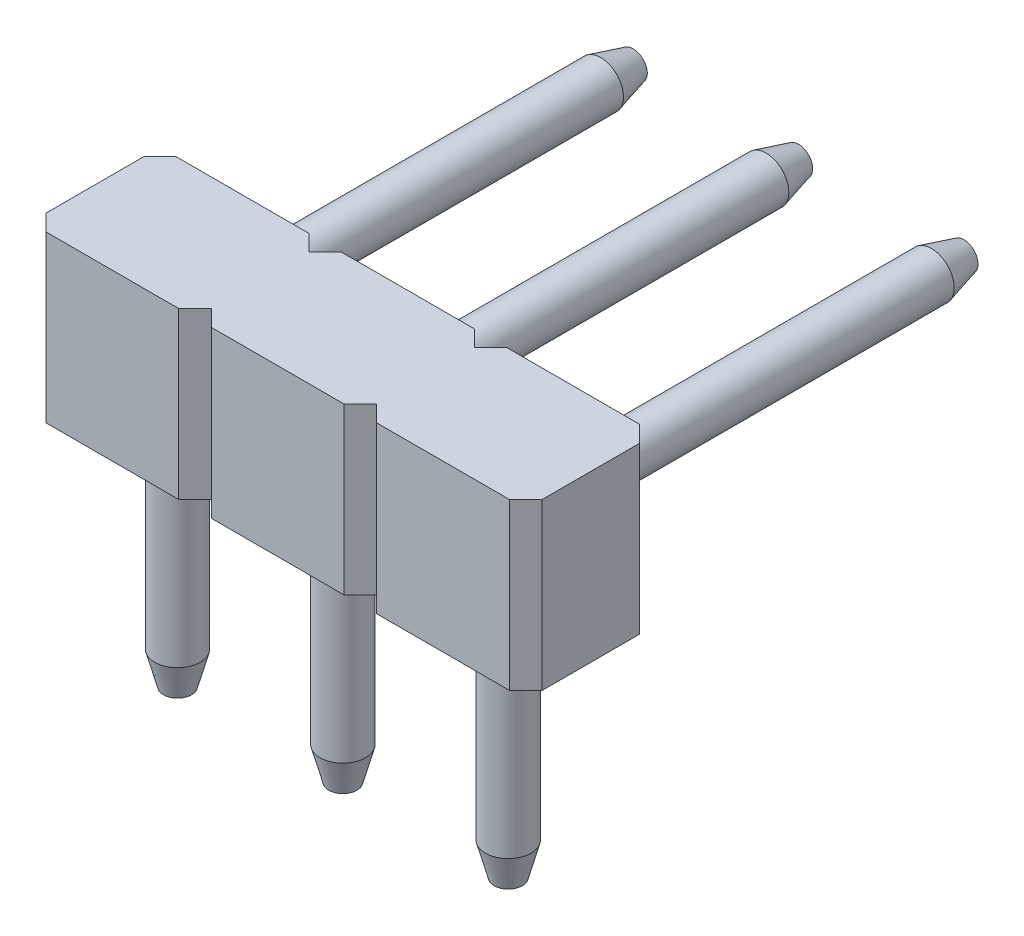
ISO-10303-21;
HEADER;
FILE_DESCRIPTION(('STEP AP214'),'2;1');
FILE_NAME('part.step','',(''),(''),'','','');
FILE_SCHEMA(('AUTOMOTIVE_DESIGN { 1 0 10303 214 1 1 1 1 }'));
ENDSEC;
DATA;
#1=APPLICATION_CONTEXT('core data for automotive mechanical design processes');
#2=APPLICATION_PROTOCOL_DEFINITION('international standard','automotive_design',2000,#1);
#3=PRODUCT_CONTEXT('',#1,'mechanical');
#4=PRODUCT('Part','Part','',(#3));
#5=PRODUCT_RELATED_PRODUCT_CATEGORY('part','',(#4));
#6=PRODUCT_DEFINITION_FORMATION('','',#4);
#7=PRODUCT_DEFINITION_CONTEXT('part definition',#1,'design');
#8=PRODUCT_DEFINITION('design','',#6,#7);
#9=PRODUCT_DEFINITION_SHAPE('','',#8);
#10=(LENGTH_UNIT() NAMED_UNIT(*) SI_UNIT(.MILLI.,.METRE.));
#11=(NAMED_UNIT(*) PLANE_ANGLE_UNIT() SI_UNIT($,.RADIAN.));
#12=(NAMED_UNIT(*) SI_UNIT($,.STERADIAN.) SOLID_ANGLE_UNIT());
#13=UNCERTAINTY_MEASURE_WITH_UNIT(LENGTH_MEASURE(1.E-05),#10,'distance_accuracy_value','');
#14=(GEOMETRIC_REPRESENTATION_CONTEXT(3) GLOBAL_UNCERTAINTY_ASSIGNED_CONTEXT((#13)) GLOBAL_UNIT_ASSIGNED_CONTEXT((#10,
#11,#12)) REPRESENTATION_CONTEXT('',''));
#15=CARTESIAN_POINT('',(0.,0.,0.));
#16=DIRECTION('',(0.,0.,1.));
#17=DIRECTION('',(1.,0.,0.));
#18=AXIS2_PLACEMENT_3D('',#15,#16,#17);
#19=CARTESIAN_POINT('',(5.08,-3.5,0.));
#20=DIRECTION('',(0.,1.,0.));
#21=DIRECTION('',(0.,0.,1.));
#22=AXIS2_PLACEMENT_3D('',#19,#20,#21);
#23=CYLINDRICAL_SURFACE('',#22,0.35);
#24=CARTESIAN_POINT('',(5.08,0.499999999999993,0.));
#25=DIRECTION('',(0.,1.,0.));
#26=DIRECTION('',(0.,0.,1.));
#27=AXIS2_PLACEMENT_3D('',#24,#25,#26);
#28=CIRCLE('',#27,0.35);
#29=CARTESIAN_POINT('',(5.08,0.499999999999993,0.35));
#30=VERTEX_POINT('',#29);
#31=EDGE_CURVE('E49',#30,#30,#28,.F.);
#32=ORIENTED_EDGE('',*,*,#31,.T.);
#33=EDGE_LOOP('',(#32));
#34=FACE_BOUND('',#33,.T.);
#35=CARTESIAN_POINT('',(5.08,-3.,0.));
#36=DIRECTION('',(0.,1.,0.));
#37=DIRECTION('',(0.,0.,1.));
#38=AXIS2_PLACEMENT_3D('',#35,#36,#37);
#39=CIRCLE('',#38,0.35);
#40=CARTESIAN_POINT('',(5.08,-3.,0.35));
#41=VERTEX_POINT('',#40);
#42=EDGE_CURVE('E53',#41,#41,#39,.T.);
#43=ORIENTED_EDGE('',*,*,#42,.T.);
#44=EDGE_LOOP('',(#43));
#45=FACE_BOUND('',#44,.T.);
#46=ADVANCED_FACE('F42',(#34,#45),#23,.T.);
#47=CARTESIAN_POINT('',(5.08,-3.5,0.));
#48=DIRECTION('',(0.,1.,0.));
#49=DIRECTION('',(0.,0.,1.));
#50=AXIS2_PLACEMENT_3D('',#47,#48,#49);
#51=PLANE('',#50);
#52=CARTESIAN_POINT('',(5.08,-3.5,0.));
#53=DIRECTION('',(0.,1.,0.));
#54=DIRECTION('',(0.,0.,1.));
#55=AXIS2_PLACEMENT_3D('',#52,#53,#54);
#56=CIRCLE('',#55,0.21602540378444);
#57=CARTESIAN_POINT('',(5.08,-3.5,0.21602540378444));
#58=VERTEX_POINT('',#57);
#59=EDGE_CURVE('E11',#58,#58,#56,.F.);
#60=ORIENTED_EDGE('',*,*,#59,.T.);
#61=EDGE_LOOP('',(#60));
#62=FACE_BOUND('',#61,.T.);
#63=ADVANCED_FACE('F73',(#62),#51,.F.);
#64=CARTESIAN_POINT('',(5.08,1.,0.));
#65=DIRECTION('',(0.,1.,0.));
#66=DIRECTION('',(0.,0.,1.));
#67=AXIS2_PLACEMENT_3D('',#64,#65,#66);
#68=PLANE('',#67);
#69=CARTESIAN_POINT('',(5.08,1.,0.));
#70=DIRECTION('',(0.,1.,0.));
#71=DIRECTION('',(0.,0.,1.));
#72=AXIS2_PLACEMENT_3D('',#69,#70,#71);
#73=CIRCLE('',#72,0.216025403784438);
#74=CARTESIAN_POINT('',(5.08,1.,0.216025403784438));
#75=VERTEX_POINT('',#74);
#76=EDGE_CURVE('E57',#75,#75,#73,.T.);
#77=ORIENTED_EDGE('',*,*,#76,.T.);
#78=EDGE_LOOP('',(#77));
#79=FACE_BOUND('',#78,.T.);
#80=ADVANCED_FACE('F63',(#79),#68,.T.);
#81=CARTESIAN_POINT('',(5.08,1.,0.));
#82=DIRECTION('',(0.,-1.,0.));
#83=DIRECTION('',(0.,0.,-1.));
#84=AXIS2_PLACEMENT_3D('',#81,#82,#83);
#85=CONICAL_SURFACE('',#84,0.216025403784438,0.261799387799146);
#86=ORIENTED_EDGE('',*,*,#31,.F.);
#87=EDGE_LOOP('',(#86));
#88=FACE_BOUND('',#87,.T.);
#89=ORIENTED_EDGE('',*,*,#76,.F.);
#90=EDGE_LOOP('',(#89));
#91=FACE_BOUND('',#90,.T.);
#92=ADVANCED_FACE('F65',(#88,#91),#85,.T.);
#93=CARTESIAN_POINT('',(5.08,-3.,0.));
#94=DIRECTION('',(0.,1.,0.));
#95=DIRECTION('',(0.,0.,1.));
#96=AXIS2_PLACEMENT_3D('',#93,#94,#95);
#97=CONICAL_SURFACE('',#96,0.35,0.261799387799147);
#98=ORIENTED_EDGE('',*,*,#59,.F.);
#99=EDGE_LOOP('',(#98));
#100=FACE_BOUND('',#99,.T.);
#101=ORIENTED_EDGE('',*,*,#42,.F.);
#102=EDGE_LOOP('',(#101));
#103=FACE_BOUND('',#102,.T.);
#104=ADVANCED_FACE('F44',(#100,#103),#97,.T.);
#105=CLOSED_SHELL('',(#46,#63,#80,#92,#104));
#106=MANIFOLD_SOLID_BREP('B2',#105);
#107=CARTESIAN_POINT('',(2.54,-3.5,0.));
#108=DIRECTION('',(0.,1.,0.));
#109=DIRECTION('',(0.,0.,1.));
#110=AXIS2_PLACEMENT_3D('',#107,#108,#109);
#111=CYLINDRICAL_SURFACE('',#110,0.35);
#112=CARTESIAN_POINT('',(2.54,-3.,0.));
#113=DIRECTION('',(0.,1.,0.));
#114=DIRECTION('',(0.,0.,1.));
#115=AXIS2_PLACEMENT_3D('',#112,#113,#114);
#116=CIRCLE('',#115,0.35);
#117=CARTESIAN_POINT('',(2.54,-3.,0.35));
#118=VERTEX_POINT('',#117);
#119=EDGE_CURVE('E133',#118,#118,#116,.T.);
#120=ORIENTED_EDGE('',*,*,#119,.T.);
#121=EDGE_LOOP('',(#120));
#122=FACE_BOUND('',#121,.T.);
#123=CARTESIAN_POINT('',(2.54,0.499999999999995,0.));
#124=DIRECTION('',(0.,1.,0.));
#125=DIRECTION('',(0.,0.,1.));
#126=AXIS2_PLACEMENT_3D('',#123,#124,#125);
#127=CIRCLE('',#126,0.35);
#128=CARTESIAN_POINT('',(2.54,0.499999999999995,0.35));
#129=VERTEX_POINT('',#128);
#130=EDGE_CURVE('E137',#129,#129,#127,.F.);
#131=ORIENTED_EDGE('',*,*,#130,.T.);
#132=EDGE_LOOP('',(#131));
#133=FACE_BOUND('',#132,.T.);
#134=ADVANCED_FACE('F122',(#122,#133),#111,.T.);
#135=CARTESIAN_POINT('',(2.54,-3.5,0.));
#136=DIRECTION('',(0.,1.,0.));
#137=DIRECTION('',(0.,0.,1.));
#138=AXIS2_PLACEMENT_3D('',#135,#136,#137);
#139=PLANE('',#138);
#140=CARTESIAN_POINT('',(2.54,-3.5,0.));
#141=DIRECTION('',(0.,1.,0.));
#142=DIRECTION('',(0.,0.,1.));
#143=AXIS2_PLACEMENT_3D('',#140,#141,#142);
#144=CIRCLE('',#143,0.21602540378444);
#145=CARTESIAN_POINT('',(2.54,-3.5,0.21602540378444));
#146=VERTEX_POINT('',#145);
#147=EDGE_CURVE('E129',#146,#146,#144,.F.);
#148=ORIENTED_EDGE('',*,*,#147,.T.);
#149=EDGE_LOOP('',(#148));
#150=FACE_BOUND('',#149,.T.);
#151=ADVANCED_FACE('F153',(#150),#139,.F.);
#152=CARTESIAN_POINT('',(2.54,1.,0.));
#153=DIRECTION('',(0.,1.,0.));
#154=DIRECTION('',(0.,0.,1.));
#155=AXIS2_PLACEMENT_3D('',#152,#153,#154);
#156=PLANE('',#155);
#157=CARTESIAN_POINT('',(2.54,1.,0.));
#158=DIRECTION('',(0.,1.,0.));
#159=DIRECTION('',(0.,0.,1.));
#160=AXIS2_PLACEMENT_3D('',#157,#158,#159);
#161=CIRCLE('',#160,0.216025403784439);
#162=CARTESIAN_POINT('',(2.54,1.,0.216025403784439));
#163=VERTEX_POINT('',#162);
#164=EDGE_CURVE('E41',#163,#163,#161,.T.);
#165=ORIENTED_EDGE('',*,*,#164,.T.);
#166=EDGE_LOOP('',(#165));
#167=FACE_BOUND('',#166,.T.);
#168=ADVANCED_FACE('F150',(#167),#156,.T.);
#169=CARTESIAN_POINT('',(2.54,-3.,0.));
#170=DIRECTION('',(0.,1.,0.));
#171=DIRECTION('',(0.,0.,1.));
#172=AXIS2_PLACEMENT_3D('',#169,#170,#171);
#173=CONICAL_SURFACE('',#172,0.35,0.261799387799147);
#174=ORIENTED_EDGE('',*,*,#147,.F.);
#175=EDGE_LOOP('',(#174));
#176=FACE_BOUND('',#175,.T.);
#177=ORIENTED_EDGE('',*,*,#119,.F.);
#178=EDGE_LOOP('',(#177));
#179=FACE_BOUND('',#178,.T.);
#180=ADVANCED_FACE('F146',(#176,#179),#173,.T.);
#181=CARTESIAN_POINT('',(2.54,1.,0.));
#182=DIRECTION('',(0.,-1.,0.));
#183=DIRECTION('',(0.,0.,-1.));
#184=AXIS2_PLACEMENT_3D('',#181,#182,#183);
#185=CONICAL_SURFACE('',#184,0.216025403784439,0.261799387799146);
#186=ORIENTED_EDGE('',*,*,#130,.F.);
#187=EDGE_LOOP('',(#186));
#188=FACE_BOUND('',#187,.T.);
#189=ORIENTED_EDGE('',*,*,#164,.F.);
#190=EDGE_LOOP('',(#189));
#191=FACE_BOUND('',#190,.T.);
#192=ADVANCED_FACE('F124',(#188,#191),#185,.T.);
#193=CLOSED_SHELL('',(#134,#151,#168,#180,#192));
#194=MANIFOLD_SOLID_BREP('B6',#193);
#195=CARTESIAN_POINT('',(-1.02,2.54,-1.));
#196=DIRECTION('',(0.,0.,1.));
#197=DIRECTION('',(1.,0.,0.));
#198=AXIS2_PLACEMENT_3D('',#195,#196,#197);
#199=PLANE('',#198);
#200=DIRECTION('',(-1.,0.,0.));
#201=VECTOR('',#200,1.);
#202=CARTESIAN_POINT('',(-1.02,0.,-1.));
#203=LINE('',#202,#201);
#204=CARTESIAN_POINT('',(1.02,0.,-1.));
#205=VERTEX_POINT('',#204);
#206=CARTESIAN_POINT('',(-1.02,0.,-1.));
#207=VERTEX_POINT('',#206);
#208=EDGE_CURVE('E364',#205,#207,#203,.T.);
#209=ORIENTED_EDGE('',*,*,#208,.T.);
#210=DIRECTION('',(0.,-1.,0.));
#211=VECTOR('',#210,1.);
#212=CARTESIAN_POINT('',(-1.02,2.54,-1.));
#213=LINE('',#212,#211);
#214=CARTESIAN_POINT('',(-1.02,2.54,-1.));
#215=VERTEX_POINT('',#214);
#216=EDGE_CURVE('E451',#215,#207,#213,.T.);
#217=ORIENTED_EDGE('',*,*,#216,.F.);
#218=DIRECTION('',(-1.,0.,0.));
#219=VECTOR('',#218,1.);
#220=CARTESIAN_POINT('',(-1.02,2.54,-1.));
#221=LINE('',#220,#219);
#222=CARTESIAN_POINT('',(1.02,2.54,-1.));
#223=VERTEX_POINT('',#222);
#224=EDGE_CURVE('E402',#223,#215,#221,.T.);
#225=ORIENTED_EDGE('',*,*,#224,.F.);
#226=DIRECTION('',(0.,-1.,0.));
#227=VECTOR('',#226,1.);
#228=CARTESIAN_POINT('',(1.02,2.54,-1.));
#229=LINE('',#228,#227);
#230=EDGE_CURVE('E360',#223,#205,#229,.T.);
#231=ORIENTED_EDGE('',*,*,#230,.T.);
#232=EDGE_LOOP('',(#209,#217,#225,#231));
#233=FACE_BOUND('',#232,.T.);
#234=CARTESIAN_POINT('',(0.,1.27,-1.));
#235=DIRECTION('',(0.,0.,1.));
#236=DIRECTION('',(1.,0.,0.));
#237=AXIS2_PLACEMENT_3D('',#234,#235,#236);
#238=CIRCLE('',#237,0.35);
#239=CARTESIAN_POINT('',(0.349999999999998,1.27,-1.));
#240=VERTEX_POINT('',#239);
#241=EDGE_CURVE('E468',#240,#240,#238,.F.);
#242=ORIENTED_EDGE('',*,*,#241,.F.);
#243=EDGE_LOOP('',(#242));
#244=FACE_BOUND('',#243,.T.);
#245=ADVANCED_FACE('F193',(#233,#244),#199,.F.);
#246=CARTESIAN_POINT('',(1.52,2.54,-1.));
#247=DIRECTION('',(0.,0.,1.));
#248=DIRECTION('',(1.,0.,0.));
#249=AXIS2_PLACEMENT_3D('',#246,#247,#248);
#250=PLANE('',#249);
#251=DIRECTION('',(-1.,0.,0.));
#252=VECTOR('',#251,1.);
#253=CARTESIAN_POINT('',(1.52,0.,-1.));
#254=LINE('',#253,#252);
#255=CARTESIAN_POINT('',(3.56,0.,-1.));
#256=VERTEX_POINT('',#255);
#257=CARTESIAN_POINT('',(1.52,0.,-1.));
#258=VERTEX_POINT('',#257);
#259=EDGE_CURVE('E354',#256,#258,#254,.T.);
#260=ORIENTED_EDGE('',*,*,#259,.T.);
#261=DIRECTION('',(0.,-1.,0.));
#262=VECTOR('',#261,1.);
#263=CARTESIAN_POINT('',(1.52,2.54,-1.));
#264=LINE('',#263,#262);
#265=CARTESIAN_POINT('',(1.52,2.54,-1.));
#266=VERTEX_POINT('',#265);
#267=EDGE_CURVE('E350',#266,#258,#264,.T.);
#268=ORIENTED_EDGE('',*,*,#267,.F.);
#269=DIRECTION('',(-1.,0.,0.));
#270=VECTOR('',#269,1.);
#271=CARTESIAN_POINT('',(1.52,2.54,-1.));
#272=LINE('',#271,#270);
#273=CARTESIAN_POINT('',(3.56,2.54,-1.));
#274=VERTEX_POINT('',#273);
#275=EDGE_CURVE('E339',#274,#266,#272,.T.);
#276=ORIENTED_EDGE('',*,*,#275,.F.);
#277=DIRECTION('',(0.,-1.,0.));
#278=VECTOR('',#277,1.);
#279=CARTESIAN_POINT('',(3.56,2.54,-1.));
#280=LINE('',#279,#278);
#281=EDGE_CURVE('E355',#274,#256,#280,.T.);
#282=ORIENTED_EDGE('',*,*,#281,.T.);
#283=EDGE_LOOP('',(#260,#268,#276,#282));
#284=FACE_BOUND('',#283,.T.);
#285=CARTESIAN_POINT('',(2.54,1.27,-1.));
#286=DIRECTION('',(0.,0.,1.));
#287=DIRECTION('',(1.,0.,0.));
#288=AXIS2_PLACEMENT_3D('',#285,#286,#287);
#289=CIRCLE('',#288,0.35);
#290=CARTESIAN_POINT('',(2.89,1.27,-1.));
#291=VERTEX_POINT('',#290);
#292=EDGE_CURVE('E465',#291,#291,#289,.F.);
#293=ORIENTED_EDGE('',*,*,#292,.F.);
#294=EDGE_LOOP('',(#293));
#295=FACE_BOUND('',#294,.T.);
#296=ADVANCED_FACE('F351',(#284,#295),#250,.F.);
#297=CARTESIAN_POINT('',(4.06,2.54,-1.));
#298=DIRECTION('',(0.,0.,1.));
#299=DIRECTION('',(1.,0.,0.));
#300=AXIS2_PLACEMENT_3D('',#297,#298,#299);
#301=PLANE('',#300);
#302=DIRECTION('',(-1.,0.,0.));
#303=VECTOR('',#302,1.);
#304=CARTESIAN_POINT('',(4.06,0.,-1.));
#305=LINE('',#304,#303);
#306=CARTESIAN_POINT('',(6.1,0.,-1.));
#307=VERTEX_POINT('',#306);
#308=CARTESIAN_POINT('',(4.06,0.,-1.));
#309=VERTEX_POINT('',#308);
#310=EDGE_CURVE('E393',#307,#309,#305,.T.);
#311=ORIENTED_EDGE('',*,*,#310,.T.);
#312=DIRECTION('',(0.,-1.,0.));
#313=VECTOR('',#312,1.);
#314=CARTESIAN_POINT('',(4.06,2.54,-1.));
#315=LINE('',#314,#313);
#316=CARTESIAN_POINT('',(4.06,2.54,-1.));
#317=VERTEX_POINT('',#316);
#318=EDGE_CURVE('E409',#317,#309,#315,.T.);
#319=ORIENTED_EDGE('',*,*,#318,.F.);
#320=DIRECTION('',(-1.,0.,0.));
#321=VECTOR('',#320,1.);
#322=CARTESIAN_POINT('',(4.06,2.54,-1.));
#323=LINE('',#322,#321);
#324=CARTESIAN_POINT('',(6.1,2.54,-1.));
#325=VERTEX_POINT('',#324);
#326=EDGE_CURVE('E658',#325,#317,#323,.T.);
#327=ORIENTED_EDGE('',*,*,#326,.F.);
#328=DIRECTION('',(0.,-1.,0.));
#329=VECTOR('',#328,1.);
#330=CARTESIAN_POINT('',(6.1,2.54,-1.));
#331=LINE('',#330,#329);
#332=EDGE_CURVE('E412',#325,#307,#331,.T.);
#333=ORIENTED_EDGE('',*,*,#332,.T.);
#334=EDGE_LOOP('',(#311,#319,#327,#333));
#335=FACE_BOUND('',#334,.T.);
#336=CARTESIAN_POINT('',(5.08,1.27,-1.));
#337=DIRECTION('',(0.,0.,1.));
#338=DIRECTION('',(1.,0.,0.));
#339=AXIS2_PLACEMENT_3D('',#336,#337,#338);
#340=CIRCLE('',#339,0.35);
#341=CARTESIAN_POINT('',(5.43,1.27,-1.));
#342=VERTEX_POINT('',#341);
#343=EDGE_CURVE('E462',#342,#342,#340,.F.);
#344=ORIENTED_EDGE('',*,*,#343,.F.);
#345=EDGE_LOOP('',(#344));
#346=FACE_BOUND('',#345,.T.);
#347=ADVANCED_FACE('F502',(#335,#346),#301,.F.);
#348=CARTESIAN_POINT('',(0.,-3.5,0.));
#349=DIRECTION('',(0.,1.,0.));
#350=DIRECTION('',(0.,0.,1.));
#351=AXIS2_PLACEMENT_3D('',#348,#349,#350);
#352=CYLINDRICAL_SURFACE('',#351,0.35);
#353=CARTESIAN_POINT('',(0.,0.,0.));
#354=DIRECTION('',(0.,-1.,0.));
#355=DIRECTION('',(0.,0.,-1.));
#356=AXIS2_PLACEMENT_3D('',#353,#354,#355);
#357=CIRCLE('',#356,0.35);
#358=CARTESIAN_POINT('',(0.,0.,-0.35));
#359=VERTEX_POINT('',#358);
#360=EDGE_CURVE('E459',#359,#359,#357,.F.);
#361=ORIENTED_EDGE('',*,*,#360,.F.);
#362=EDGE_LOOP('',(#361));
#363=FACE_BOUND('',#362,.T.);
#364=CARTESIAN_POINT('',(0.,-3.,0.));
#365=DIRECTION('',(0.,1.,0.));
#366=DIRECTION('',(0.,0.,1.));
#367=AXIS2_PLACEMENT_3D('',#364,#365,#366);
#368=CIRCLE('',#367,0.35);
#369=CARTESIAN_POINT('',(0.,-3.,0.35));
#370=VERTEX_POINT('',#369);
#371=EDGE_CURVE('E453',#370,#370,#368,.T.);
#372=ORIENTED_EDGE('',*,*,#371,.T.);
#373=EDGE_LOOP('',(#372));
#374=FACE_BOUND('',#373,.T.);
#375=ADVANCED_FACE('F513',(#363,#374),#352,.T.);
#376=CARTESIAN_POINT('',(0.,-3.5,0.));
#377=DIRECTION('',(0.,1.,0.));
#378=DIRECTION('',(0.,0.,1.));
#379=AXIS2_PLACEMENT_3D('',#376,#377,#378);
#380=PLANE('',#379);
#381=CARTESIAN_POINT('',(0.,-3.5,0.));
#382=DIRECTION('',(0.,1.,0.));
#383=DIRECTION('',(0.,0.,1.));
#384=AXIS2_PLACEMENT_3D('',#381,#382,#383);
#385=CIRCLE('',#384,0.21602540378444);
#386=CARTESIAN_POINT('',(0.,-3.5,0.21602540378444));
#387=VERTEX_POINT('',#386);
#388=EDGE_CURVE('E456',#387,#387,#385,.F.);
#389=ORIENTED_EDGE('',*,*,#388,.T.);
#390=EDGE_LOOP('',(#389));
#391=FACE_BOUND('',#390,.T.);
#392=ADVANCED_FACE('F509',(#391),#380,.F.);
#393=CARTESIAN_POINT('',(0.,-3.,0.));
#394=DIRECTION('',(0.,1.,0.));
#395=DIRECTION('',(0.,0.,1.));
#396=AXIS2_PLACEMENT_3D('',#393,#394,#395);
#397=CONICAL_SURFACE('',#396,0.35,0.261799387799147);
#398=ORIENTED_EDGE('',*,*,#388,.F.);
#399=EDGE_LOOP('',(#398));
#400=FACE_BOUND('',#399,.T.);
#401=ORIENTED_EDGE('',*,*,#371,.F.);
#402=EDGE_LOOP('',(#401));
#403=FACE_BOUND('',#402,.T.);
#404=ADVANCED_FACE('F512',(#400,#403),#397,.T.);
#405=CARTESIAN_POINT('',(-1.27,2.54,-0.75));
#406=DIRECTION('',(0.707106781186548,0.,0.707106781186548));
#407=DIRECTION('',(0.707106781186548,0.,-0.707106781186548));
#408=AXIS2_PLACEMENT_3D('',#405,#406,#407);
#409=PLANE('',#408);
#410=DIRECTION('',(-0.707106781186548,0.,0.707106781186548));
#411=VECTOR('',#410,1.);
#412=CARTESIAN_POINT('',(-1.27,0.,-0.75));
#413=LINE('',#412,#411);
#414=CARTESIAN_POINT('',(-1.27,0.,-0.75));
#415=VERTEX_POINT('',#414);
#416=EDGE_CURVE('E367',#207,#415,#413,.T.);
#417=ORIENTED_EDGE('',*,*,#416,.T.);
#418=DIRECTION('',(0.,-1.,0.));
#419=VECTOR('',#418,1.);
#420=CARTESIAN_POINT('',(-1.27,2.54,-0.75));
#421=LINE('',#420,#419);
#422=CARTESIAN_POINT('',(-1.27,2.54,-0.75));
#423=VERTEX_POINT('',#422);
#424=EDGE_CURVE('E448',#423,#415,#421,.T.);
#425=ORIENTED_EDGE('',*,*,#424,.F.);
#426=DIRECTION('',(-0.707106781186548,0.,0.707106781186548));
#427=VECTOR('',#426,1.);
#428=CARTESIAN_POINT('',(-1.27,2.54,-0.75));
#429=LINE('',#428,#427);
#430=EDGE_CURVE('E290',#215,#423,#429,.T.);
#431=ORIENTED_EDGE('',*,*,#430,.F.);
#432=ORIENTED_EDGE('',*,*,#216,.T.);
#433=EDGE_LOOP('',(#417,#425,#431,#432));
#434=FACE_BOUND('',#433,.T.);
#435=ADVANCED_FACE('F507',(#434),#409,.F.);
#436=CARTESIAN_POINT('',(-1.27,2.54,-0.75));
#437=DIRECTION('',(1.,0.,0.));
#438=DIRECTION('',(0.,0.,-1.));
#439=AXIS2_PLACEMENT_3D('',#436,#437,#438);
#440=PLANE('',#439);
#441=DIRECTION('',(0.,0.,1.));
#442=VECTOR('',#441,1.);
#443=CARTESIAN_POINT('',(-1.27,0.,-0.75));
#444=LINE('',#443,#442);
#445=CARTESIAN_POINT('',(-1.27,0.,0.750018973036948));
#446=VERTEX_POINT('',#445);
#447=EDGE_CURVE('E369',#415,#446,#444,.T.);
#448=ORIENTED_EDGE('',*,*,#447,.T.);
#449=DIRECTION('',(0.,-1.,0.));
#450=VECTOR('',#449,1.);
#451=CARTESIAN_POINT('',(-1.27,2.54,0.750018973036948));
#452=LINE('',#451,#450);
#453=CARTESIAN_POINT('',(-1.27,2.54,0.750018973036948));
#454=VERTEX_POINT('',#453);
#455=EDGE_CURVE('E445',#454,#446,#452,.T.);
#456=ORIENTED_EDGE('',*,*,#455,.F.);
#457=DIRECTION('',(0.,0.,1.));
#458=VECTOR('',#457,1.);
#459=CARTESIAN_POINT('',(-1.27,2.54,-0.75));
#460=LINE('',#459,#458);
#461=EDGE_CURVE('E670',#423,#454,#460,.T.);
#462=ORIENTED_EDGE('',*,*,#461,.F.);
#463=ORIENTED_EDGE('',*,*,#424,.T.);
#464=EDGE_LOOP('',(#448,#456,#462,#463));
#465=FACE_BOUND('',#464,.T.);
#466=ADVANCED_FACE('F612',(#465),#440,.F.);
#467=CARTESIAN_POINT('',(-1.27,2.54,0.750018973036948));
#468=DIRECTION('',(0.707106781186548,0.,-0.707106781186548));
#469=DIRECTION('',(-0.707106781186548,0.,-0.707106781186548));
#470=AXIS2_PLACEMENT_3D('',#467,#468,#469);
#471=PLANE('',#470);
#472=DIRECTION('',(0.707106781186548,0.,0.707106781186548));
#473=VECTOR('',#472,1.);
#474=CARTESIAN_POINT('',(-1.27,0.,0.750018973036948));
#475=LINE('',#474,#473);
#476=CARTESIAN_POINT('',(-1.02,0.,1.00001897303695));
#477=VERTEX_POINT('',#476);
#478=EDGE_CURVE('E371',#446,#477,#475,.T.);
#479=ORIENTED_EDGE('',*,*,#478,.T.);
#480=DIRECTION('',(0.,-1.,0.));
#481=VECTOR('',#480,1.);
#482=CARTESIAN_POINT('',(-1.02,2.54,1.00001897303695));
#483=LINE('',#482,#481);
#484=CARTESIAN_POINT('',(-1.02,2.54,1.00001897303695));
#485=VERTEX_POINT('',#484);
#486=EDGE_CURVE('E442',#485,#477,#483,.T.);
#487=ORIENTED_EDGE('',*,*,#486,.F.);
#488=DIRECTION('',(0.707106781186548,0.,0.707106781186548));
#489=VECTOR('',#488,1.);
#490=CARTESIAN_POINT('',(-1.27,2.54,0.750018973036948));
#491=LINE('',#490,#489);
#492=EDGE_CURVE('E626',#454,#485,#491,.T.);
#493=ORIENTED_EDGE('',*,*,#492,.F.);
#494=ORIENTED_EDGE('',*,*,#455,.T.);
#495=EDGE_LOOP('',(#479,#487,#493,#494));
#496=FACE_BOUND('',#495,.T.);
#497=ADVANCED_FACE('F609',(#496),#471,.F.);
#498=CARTESIAN_POINT('',(-1.02,2.54,1.00001897303695));
#499=DIRECTION('',(0.,0.,-1.));
#500=DIRECTION('',(-1.,0.,0.));
#501=AXIS2_PLACEMENT_3D('',#498,#499,#500);
#502=PLANE('',#501);
#503=DIRECTION('',(1.,0.,0.));
#504=VECTOR('',#503,1.);
#505=CARTESIAN_POINT('',(-1.02,0.,1.00001897303695));
#506=LINE('',#505,#504);
#507=CARTESIAN_POINT('',(1.01670740331619,0.,1.00001897303695));
#508=VERTEX_POINT('',#507);
#509=EDGE_CURVE('E373',#477,#508,#506,.T.);
#510=ORIENTED_EDGE('',*,*,#509,.T.);
#511=DIRECTION('',(0.,-1.,0.));
#512=VECTOR('',#511,1.);
#513=CARTESIAN_POINT('',(1.01670740331619,2.54,1.00001897303695));
#514=LINE('',#513,#512);
#515=CARTESIAN_POINT('',(1.01670740331619,2.54,1.00001897303695));
#516=VERTEX_POINT('',#515);
#517=EDGE_CURVE('E439',#516,#508,#514,.T.);
#518=ORIENTED_EDGE('',*,*,#517,.F.);
#519=DIRECTION('',(1.,0.,0.));
#520=VECTOR('',#519,1.);
#521=CARTESIAN_POINT('',(-1.02,2.54,1.00001897303695));
#522=LINE('',#521,#520);
#523=EDGE_CURVE('E638',#485,#516,#522,.T.);
#524=ORIENTED_EDGE('',*,*,#523,.F.);
#525=ORIENTED_EDGE('',*,*,#486,.T.);
#526=EDGE_LOOP('',(#510,#518,#524,#525));
#527=FACE_BOUND('',#526,.T.);
#528=ADVANCED_FACE('F605',(#527),#502,.F.);
#529=CARTESIAN_POINT('',(1.27,2.54,0.750018973036948));
#530=DIRECTION('',(-0.702465776883309,0.,-0.711717522833131));
#531=DIRECTION('',(-0.711717522833131,0.,0.702465776883309));
#532=AXIS2_PLACEMENT_3D('',#529,#530,#531);
#533=PLANE('',#532);
#534=DIRECTION('',(0.711717522833131,0.,-0.702465776883309));
#535=VECTOR('',#534,1.);
#536=CARTESIAN_POINT('',(1.27,0.,0.750018973036948));
#537=LINE('',#536,#535);
#538=CARTESIAN_POINT('',(1.27,0.,0.750018973036948));
#539=VERTEX_POINT('',#538);
#540=EDGE_CURVE('E375',#508,#539,#537,.T.);
#541=ORIENTED_EDGE('',*,*,#540,.T.);
#542=DIRECTION('',(0.,-1.,0.));
#543=VECTOR('',#542,1.);
#544=CARTESIAN_POINT('',(1.27,2.54,0.750018973036948));
#545=LINE('',#544,#543);
#546=CARTESIAN_POINT('',(1.27,2.54,0.750018973036948));
#547=VERTEX_POINT('',#546);
#548=EDGE_CURVE('E436',#547,#539,#545,.T.);
#549=ORIENTED_EDGE('',*,*,#548,.F.);
#550=DIRECTION('',(0.711717522833131,0.,-0.702465776883309));
#551=VECTOR('',#550,1.);
#552=CARTESIAN_POINT('',(1.27,2.54,0.750018973036948));
#553=LINE('',#552,#551);
#554=EDGE_CURVE('E635',#516,#547,#553,.T.);
#555=ORIENTED_EDGE('',*,*,#554,.F.);
#556=ORIENTED_EDGE('',*,*,#517,.T.);
#557=EDGE_LOOP('',(#541,#549,#555,#556));
#558=FACE_BOUND('',#557,.T.);
#559=ADVANCED_FACE('F601',(#558),#533,.F.);
#560=CARTESIAN_POINT('',(1.27,2.54,0.750018973036948));
#561=DIRECTION('',(0.707106781186548,0.,-0.707106781186548));
#562=DIRECTION('',(-0.707106781186548,0.,-0.707106781186548));
#563=AXIS2_PLACEMENT_3D('',#560,#561,#562);
#564=PLANE('',#563);
#565=DIRECTION('',(0.707106781186548,0.,0.707106781186548));
#566=VECTOR('',#565,1.);
#567=CARTESIAN_POINT('',(1.27,0.,0.750018973036948));
#568=LINE('',#567,#566);
#569=CARTESIAN_POINT('',(1.52,0.,1.00001897303695));
#570=VERTEX_POINT('',#569);
#571=EDGE_CURVE('E377',#539,#570,#568,.T.);
#572=ORIENTED_EDGE('',*,*,#571,.T.);
#573=DIRECTION('',(0.,-1.,0.));
#574=VECTOR('',#573,1.);
#575=CARTESIAN_POINT('',(1.52,2.54,1.00001897303695));
#576=LINE('',#575,#574);
#577=CARTESIAN_POINT('',(1.52,2.54,1.00001897303695));
#578=VERTEX_POINT('',#577);
#579=EDGE_CURVE('E433',#578,#570,#576,.T.);
#580=ORIENTED_EDGE('',*,*,#579,.F.);
#581=DIRECTION('',(0.707106781186548,0.,0.707106781186548));
#582=VECTOR('',#581,1.);
#583=CARTESIAN_POINT('',(1.27,2.54,0.750018973036948));
#584=LINE('',#583,#582);
#585=EDGE_CURVE('E637',#547,#578,#584,.T.);
#586=ORIENTED_EDGE('',*,*,#585,.F.);
#587=ORIENTED_EDGE('',*,*,#548,.T.);
#588=EDGE_LOOP('',(#572,#580,#586,#587));
#589=FACE_BOUND('',#588,.T.);
#590=ADVANCED_FACE('F597',(#589),#564,.F.);
#591=CARTESIAN_POINT('',(1.52,2.54,1.00001897303695));
#592=DIRECTION('',(0.,0.,-1.));
#593=DIRECTION('',(-1.,0.,0.));
#594=AXIS2_PLACEMENT_3D('',#591,#592,#593);
#595=PLANE('',#594);
#596=DIRECTION('',(1.,0.,0.));
#597=VECTOR('',#596,1.);
#598=CARTESIAN_POINT('',(1.52,0.,1.00001897303695));
#599=LINE('',#598,#597);
#600=CARTESIAN_POINT('',(3.55670740331619,0.,1.00001897303695));
#601=VERTEX_POINT('',#600);
#602=EDGE_CURVE('E379',#570,#601,#599,.T.);
#603=ORIENTED_EDGE('',*,*,#602,.T.);
#604=DIRECTION('',(0.,-1.,0.));
#605=VECTOR('',#604,1.);
#606=CARTESIAN_POINT('',(3.55670740331619,2.54,1.00001897303695));
#607=LINE('',#606,#605);
#608=CARTESIAN_POINT('',(3.55670740331619,2.54,1.00001897303695));
#609=VERTEX_POINT('',#608);
#610=EDGE_CURVE('E430',#609,#601,#607,.T.);
#611=ORIENTED_EDGE('',*,*,#610,.F.);
#612=DIRECTION('',(1.,0.,0.));
#613=VECTOR('',#612,1.);
#614=CARTESIAN_POINT('',(1.52,2.54,1.00001897303695));
#615=LINE('',#614,#613);
#616=EDGE_CURVE('E640',#578,#609,#615,.T.);
#617=ORIENTED_EDGE('',*,*,#616,.F.);
#618=ORIENTED_EDGE('',*,*,#579,.T.);
#619=EDGE_LOOP('',(#603,#611,#617,#618));
#620=FACE_BOUND('',#619,.T.);
#621=ADVANCED_FACE('F593',(#620),#595,.F.);
#622=CARTESIAN_POINT('',(3.81,2.54,0.750018973036948));
#623=DIRECTION('',(-0.70246577688331,0.,-0.711717522833131));
#624=DIRECTION('',(-0.711717522833131,0.,0.70246577688331));
#625=AXIS2_PLACEMENT_3D('',#622,#623,#624);
#626=PLANE('',#625);
#627=DIRECTION('',(0.71171752283313,0.,-0.70246577688331));
#628=VECTOR('',#627,1.);
#629=CARTESIAN_POINT('',(3.81,0.,0.750018973036948));
#630=LINE('',#629,#628);
#631=CARTESIAN_POINT('',(3.81,0.,0.750018973036948));
#632=VERTEX_POINT('',#631);
#633=EDGE_CURVE('E381',#601,#632,#630,.T.);
#634=ORIENTED_EDGE('',*,*,#633,.T.);
#635=DIRECTION('',(0.,-1.,0.));
#636=VECTOR('',#635,1.);
#637=CARTESIAN_POINT('',(3.81,2.54,0.750018973036948));
#638=LINE('',#637,#636);
#639=CARTESIAN_POINT('',(3.81,2.54,0.750018973036948));
#640=VERTEX_POINT('',#639);
#641=EDGE_CURVE('E427',#640,#632,#638,.T.);
#642=ORIENTED_EDGE('',*,*,#641,.F.);
#643=DIRECTION('',(0.71171752283313,0.,-0.70246577688331));
#644=VECTOR('',#643,1.);
#645=CARTESIAN_POINT('',(3.81,2.54,0.750018973036948));
#646=LINE('',#645,#644);
#647=EDGE_CURVE('E646',#609,#640,#646,.T.);
#648=ORIENTED_EDGE('',*,*,#647,.F.);
#649=ORIENTED_EDGE('',*,*,#610,.T.);
#650=EDGE_LOOP('',(#634,#642,#648,#649));
#651=FACE_BOUND('',#650,.T.);
#652=ADVANCED_FACE('F589',(#651),#626,.F.);
#653=CARTESIAN_POINT('',(3.81,2.54,0.750018973036948));
#654=DIRECTION('',(0.707106781186547,0.,-0.707106781186548));
#655=DIRECTION('',(-0.707106781186548,0.,-0.707106781186547));
#656=AXIS2_PLACEMENT_3D('',#653,#654,#655);
#657=PLANE('',#656);
#658=DIRECTION('',(0.707106781186548,0.,0.707106781186547));
#659=VECTOR('',#658,1.);
#660=CARTESIAN_POINT('',(3.81,0.,0.750018973036948));
#661=LINE('',#660,#659);
#662=CARTESIAN_POINT('',(4.06,0.,1.00001897303695));
#663=VERTEX_POINT('',#662);
#664=EDGE_CURVE('E383',#632,#663,#661,.T.);
#665=ORIENTED_EDGE('',*,*,#664,.T.);
#666=DIRECTION('',(0.,-1.,0.));
#667=VECTOR('',#666,1.);
#668=CARTESIAN_POINT('',(4.06,2.54,1.00001897303695));
#669=LINE('',#668,#667);
#670=CARTESIAN_POINT('',(4.06,2.54,1.00001897303695));
#671=VERTEX_POINT('',#670);
#672=EDGE_CURVE('E424',#671,#663,#669,.T.);
#673=ORIENTED_EDGE('',*,*,#672,.F.);
#674=DIRECTION('',(0.707106781186548,0.,0.707106781186547));
#675=VECTOR('',#674,1.);
#676=CARTESIAN_POINT('',(3.81,2.54,0.750018973036948));
#677=LINE('',#676,#675);
#678=EDGE_CURVE('E648',#640,#671,#677,.T.);
#679=ORIENTED_EDGE('',*,*,#678,.F.);
#680=ORIENTED_EDGE('',*,*,#641,.T.);
#681=EDGE_LOOP('',(#665,#673,#679,#680));
#682=FACE_BOUND('',#681,.T.);
#683=ADVANCED_FACE('F585',(#682),#657,.F.);
#684=CARTESIAN_POINT('',(4.06,2.54,1.00001897303695));
#685=DIRECTION('',(0.,0.,-1.));
#686=DIRECTION('',(-1.,0.,0.));
#687=AXIS2_PLACEMENT_3D('',#684,#685,#686);
#688=PLANE('',#687);
#689=DIRECTION('',(1.,0.,0.));
#690=VECTOR('',#689,1.);
#691=CARTESIAN_POINT('',(4.06,0.,1.00001897303695));
#692=LINE('',#691,#690);
#693=CARTESIAN_POINT('',(6.09670740331619,0.,1.00001897303695));
#694=VERTEX_POINT('',#693);
#695=EDGE_CURVE('E385',#663,#694,#692,.T.);
#696=ORIENTED_EDGE('',*,*,#695,.T.);
#697=DIRECTION('',(0.,-1.,0.));
#698=VECTOR('',#697,1.);
#699=CARTESIAN_POINT('',(6.09670740331619,2.54,1.00001897303695));
#700=LINE('',#699,#698);
#701=CARTESIAN_POINT('',(6.09670740331619,2.54,1.00001897303695));
#702=VERTEX_POINT('',#701);
#703=EDGE_CURVE('E421',#702,#694,#700,.T.);
#704=ORIENTED_EDGE('',*,*,#703,.F.);
#705=DIRECTION('',(1.,0.,0.));
#706=VECTOR('',#705,1.);
#707=CARTESIAN_POINT('',(4.06,2.54,1.00001897303695));
#708=LINE('',#707,#706);
#709=EDGE_CURVE('E650',#671,#702,#708,.T.);
#710=ORIENTED_EDGE('',*,*,#709,.F.);
#711=ORIENTED_EDGE('',*,*,#672,.T.);
#712=EDGE_LOOP('',(#696,#704,#710,#711));
#713=FACE_BOUND('',#712,.T.);
#714=ADVANCED_FACE('F581',(#713),#688,.F.);
#715=CARTESIAN_POINT('',(6.35,2.54,0.750018973036948));
#716=DIRECTION('',(-0.70246577688331,0.,-0.711717522833131));
#717=DIRECTION('',(-0.711717522833131,0.,0.70246577688331));
#718=AXIS2_PLACEMENT_3D('',#715,#716,#717);
#719=PLANE('',#718);
#720=DIRECTION('',(0.71171752283313,0.,-0.70246577688331));
#721=VECTOR('',#720,1.);
#722=CARTESIAN_POINT('',(6.35,0.,0.750018973036948));
#723=LINE('',#722,#721);
#724=CARTESIAN_POINT('',(6.35,0.,0.750018973036948));
#725=VERTEX_POINT('',#724);
#726=EDGE_CURVE('E387',#694,#725,#723,.T.);
#727=ORIENTED_EDGE('',*,*,#726,.T.);
#728=DIRECTION('',(0.,-1.,0.));
#729=VECTOR('',#728,1.);
#730=CARTESIAN_POINT('',(6.35,2.54,0.750018973036948));
#731=LINE('',#730,#729);
#732=CARTESIAN_POINT('',(6.35,2.54,0.750018973036948));
#733=VERTEX_POINT('',#732);
#734=EDGE_CURVE('E418',#733,#725,#731,.T.);
#735=ORIENTED_EDGE('',*,*,#734,.F.);
#736=DIRECTION('',(0.71171752283313,0.,-0.70246577688331));
#737=VECTOR('',#736,1.);
#738=CARTESIAN_POINT('',(6.35,2.54,0.750018973036948));
#739=LINE('',#738,#737);
#740=EDGE_CURVE('E652',#702,#733,#739,.T.);
#741=ORIENTED_EDGE('',*,*,#740,.F.);
#742=ORIENTED_EDGE('',*,*,#703,.T.);
#743=EDGE_LOOP('',(#727,#735,#741,#742));
#744=FACE_BOUND('',#743,.T.);
#745=ADVANCED_FACE('F577',(#744),#719,.F.);
#746=CARTESIAN_POINT('',(6.35,2.54,-0.75));
#747=DIRECTION('',(-1.,0.,0.));
#748=DIRECTION('',(0.,0.,1.));
#749=AXIS2_PLACEMENT_3D('',#746,#747,#748);
#750=PLANE('',#749);
#751=DIRECTION('',(0.,0.,-1.));
#752=VECTOR('',#751,1.);
#753=CARTESIAN_POINT('',(6.35,0.,-0.75));
#754=LINE('',#753,#752);
#755=CARTESIAN_POINT('',(6.35,0.,-0.75));
#756=VERTEX_POINT('',#755);
#757=EDGE_CURVE('E389',#725,#756,#754,.T.);
#758=ORIENTED_EDGE('',*,*,#757,.T.);
#759=DIRECTION('',(0.,-1.,0.));
#760=VECTOR('',#759,1.);
#761=CARTESIAN_POINT('',(6.35,2.54,-0.75));
#762=LINE('',#761,#760);
#763=CARTESIAN_POINT('',(6.35,2.54,-0.75));
#764=VERTEX_POINT('',#763);
#765=EDGE_CURVE('E415',#764,#756,#762,.T.);
#766=ORIENTED_EDGE('',*,*,#765,.F.);
#767=DIRECTION('',(0.,0.,-1.));
#768=VECTOR('',#767,1.);
#769=CARTESIAN_POINT('',(6.35,2.54,-0.75));
#770=LINE('',#769,#768);
#771=EDGE_CURVE('E654',#733,#764,#770,.T.);
#772=ORIENTED_EDGE('',*,*,#771,.F.);
#773=ORIENTED_EDGE('',*,*,#734,.T.);
#774=EDGE_LOOP('',(#758,#766,#772,#773));
#775=FACE_BOUND('',#774,.T.);
#776=ADVANCED_FACE('F573',(#775),#750,.F.);
#777=CARTESIAN_POINT('',(6.1,2.54,-1.));
#778=DIRECTION('',(-0.707106781186548,0.,0.707106781186547));
#779=DIRECTION('',(0.707106781186547,0.,0.707106781186548));
#780=AXIS2_PLACEMENT_3D('',#777,#778,#779);
#781=PLANE('',#780);
#782=DIRECTION('',(-0.707106781186547,0.,-0.707106781186548));
#783=VECTOR('',#782,1.);
#784=CARTESIAN_POINT('',(6.1,0.,-1.));
#785=LINE('',#784,#783);
#786=EDGE_CURVE('E391',#756,#307,#785,.T.);
#787=ORIENTED_EDGE('',*,*,#786,.T.);
#788=ORIENTED_EDGE('',*,*,#332,.F.);
#789=DIRECTION('',(-0.707106781186547,0.,-0.707106781186548));
#790=VECTOR('',#789,1.);
#791=CARTESIAN_POINT('',(6.1,2.54,-1.));
#792=LINE('',#791,#790);
#793=EDGE_CURVE('E656',#764,#325,#792,.T.);
#794=ORIENTED_EDGE('',*,*,#793,.F.);
#795=ORIENTED_EDGE('',*,*,#765,.T.);
#796=EDGE_LOOP('',(#787,#788,#794,#795));
#797=FACE_BOUND('',#796,.T.);
#798=ADVANCED_FACE('F566',(#797),#781,.F.);
#799=CARTESIAN_POINT('',(3.81,2.54,-0.75));
#800=DIRECTION('',(0.707106781186548,0.,0.707106781186547));
#801=DIRECTION('',(0.707106781186547,0.,-0.707106781186548));
#802=AXIS2_PLACEMENT_3D('',#799,#800,#801);
#803=PLANE('',#802);
#804=DIRECTION('',(-0.707106781186547,0.,0.707106781186548));
#805=VECTOR('',#804,1.);
#806=CARTESIAN_POINT('',(3.81,0.,-0.75));
#807=LINE('',#806,#805);
#808=CARTESIAN_POINT('',(3.81,0.,-0.75));
#809=VERTEX_POINT('',#808);
#810=EDGE_CURVE('E395',#309,#809,#807,.T.);
#811=ORIENTED_EDGE('',*,*,#810,.T.);
#812=DIRECTION('',(0.,-1.,0.));
#813=VECTOR('',#812,1.);
#814=CARTESIAN_POINT('',(3.81,2.54,-0.75));
#815=LINE('',#814,#813);
#816=CARTESIAN_POINT('',(3.81,2.54,-0.75));
#817=VERTEX_POINT('',#816);
#818=EDGE_CURVE('E406',#817,#809,#815,.T.);
#819=ORIENTED_EDGE('',*,*,#818,.F.);
#820=DIRECTION('',(-0.707106781186547,0.,0.707106781186548));
#821=VECTOR('',#820,1.);
#822=CARTESIAN_POINT('',(3.81,2.54,-0.75));
#823=LINE('',#822,#821);
#824=EDGE_CURVE('E660',#317,#817,#823,.T.);
#825=ORIENTED_EDGE('',*,*,#824,.F.);
#826=ORIENTED_EDGE('',*,*,#318,.T.);
#827=EDGE_LOOP('',(#811,#819,#825,#826));
#828=FACE_BOUND('',#827,.T.);
#829=ADVANCED_FACE('F562',(#828),#803,.F.);
#830=CARTESIAN_POINT('',(3.56,2.54,-1.));
#831=DIRECTION('',(-0.707106781186548,0.,0.707106781186547));
#832=DIRECTION('',(0.707106781186547,0.,0.707106781186548));
#833=AXIS2_PLACEMENT_3D('',#830,#831,#832);
#834=PLANE('',#833);
#835=DIRECTION('',(-0.707106781186547,0.,-0.707106781186548));
#836=VECTOR('',#835,1.);
#837=CARTESIAN_POINT('',(3.56,0.,-1.));
#838=LINE('',#837,#836);
#839=EDGE_CURVE('E397',#809,#256,#838,.T.);
#840=ORIENTED_EDGE('',*,*,#839,.T.);
#841=ORIENTED_EDGE('',*,*,#281,.F.);
#842=DIRECTION('',(-0.707106781186547,0.,-0.707106781186548));
#843=VECTOR('',#842,1.);
#844=CARTESIAN_POINT('',(3.56,2.54,-1.));
#845=LINE('',#844,#843);
#846=EDGE_CURVE('E345',#817,#274,#845,.T.);
#847=ORIENTED_EDGE('',*,*,#846,.F.);
#848=ORIENTED_EDGE('',*,*,#818,.T.);
#849=EDGE_LOOP('',(#840,#841,#847,#848));
#850=FACE_BOUND('',#849,.T.);
#851=ADVANCED_FACE('F558',(#850),#834,.F.);
#852=CARTESIAN_POINT('',(1.27,2.54,-0.75));
#853=DIRECTION('',(0.707106781186548,0.,0.707106781186548));
#854=DIRECTION('',(0.707106781186548,0.,-0.707106781186548));
#855=AXIS2_PLACEMENT_3D('',#852,#853,#854);
#856=PLANE('',#855);
#857=DIRECTION('',(-0.707106781186548,0.,0.707106781186548));
#858=VECTOR('',#857,1.);
#859=CARTESIAN_POINT('',(1.27,0.,-0.75));
#860=LINE('',#859,#858);
#861=CARTESIAN_POINT('',(1.27,0.,-0.75));
#862=VERTEX_POINT('',#861);
#863=EDGE_CURVE('E275',#258,#862,#860,.T.);
#864=ORIENTED_EDGE('',*,*,#863,.T.);
#865=DIRECTION('',(0.,-1.,0.));
#866=VECTOR('',#865,1.);
#867=CARTESIAN_POINT('',(1.27,2.54,-0.75));
#868=LINE('',#867,#866);
#869=CARTESIAN_POINT('',(1.27,2.54,-0.75));
#870=VERTEX_POINT('',#869);
#871=EDGE_CURVE('E356',#870,#862,#868,.T.);
#872=ORIENTED_EDGE('',*,*,#871,.F.);
#873=DIRECTION('',(-0.707106781186548,0.,0.707106781186548));
#874=VECTOR('',#873,1.);
#875=CARTESIAN_POINT('',(1.27,2.54,-0.75));
#876=LINE('',#875,#874);
#877=EDGE_CURVE('E343',#266,#870,#876,.T.);
#878=ORIENTED_EDGE('',*,*,#877,.F.);
#879=ORIENTED_EDGE('',*,*,#267,.T.);
#880=EDGE_LOOP('',(#864,#872,#878,#879));
#881=FACE_BOUND('',#880,.T.);
#882=ADVANCED_FACE('F358',(#881),#856,.F.);
#883=CARTESIAN_POINT('',(1.02,2.54,-1.));
#884=DIRECTION('',(-0.707106781186548,0.,0.707106781186547));
#885=DIRECTION('',(0.707106781186547,0.,0.707106781186548));
#886=AXIS2_PLACEMENT_3D('',#883,#884,#885);
#887=PLANE('',#886);
#888=DIRECTION('',(-0.707106781186547,0.,-0.707106781186548));
#889=VECTOR('',#888,1.);
#890=CARTESIAN_POINT('',(1.02,0.,-1.));
#891=LINE('',#890,#889);
#892=EDGE_CURVE('E281',#862,#205,#891,.T.);
#893=ORIENTED_EDGE('',*,*,#892,.T.);
#894=ORIENTED_EDGE('',*,*,#230,.F.);
#895=DIRECTION('',(-0.707106781186547,0.,-0.707106781186548));
#896=VECTOR('',#895,1.);
#897=CARTESIAN_POINT('',(1.02,2.54,-1.));
#898=LINE('',#897,#896);
#899=EDGE_CURVE('E210',#870,#223,#898,.T.);
#900=ORIENTED_EDGE('',*,*,#899,.F.);
#901=ORIENTED_EDGE('',*,*,#871,.T.);
#902=EDGE_LOOP('',(#893,#894,#900,#901));
#903=FACE_BOUND('',#902,.T.);
#904=ADVANCED_FACE('F551',(#903),#887,.F.);
#905=CARTESIAN_POINT('',(0.,2.54,0.));
#906=DIRECTION('',(0.,-1.,0.));
#907=DIRECTION('',(0.,0.,-1.));
#908=AXIS2_PLACEMENT_3D('',#905,#906,#907);
#909=PLANE('',#908);
#910=ORIENTED_EDGE('',*,*,#224,.T.);
#911=ORIENTED_EDGE('',*,*,#430,.T.);
#912=ORIENTED_EDGE('',*,*,#461,.T.);
#913=ORIENTED_EDGE('',*,*,#492,.T.);
#914=ORIENTED_EDGE('',*,*,#523,.T.);
#915=ORIENTED_EDGE('',*,*,#554,.T.);
#916=ORIENTED_EDGE('',*,*,#585,.T.);
#917=ORIENTED_EDGE('',*,*,#616,.T.);
#918=ORIENTED_EDGE('',*,*,#647,.T.);
#919=ORIENTED_EDGE('',*,*,#678,.T.);
#920=ORIENTED_EDGE('',*,*,#709,.T.);
#921=ORIENTED_EDGE('',*,*,#740,.T.);
#922=ORIENTED_EDGE('',*,*,#771,.T.);
#923=ORIENTED_EDGE('',*,*,#793,.T.);
#924=ORIENTED_EDGE('',*,*,#326,.T.);
#925=ORIENTED_EDGE('',*,*,#824,.T.);
#926=ORIENTED_EDGE('',*,*,#846,.T.);
#927=ORIENTED_EDGE('',*,*,#275,.T.);
#928=ORIENTED_EDGE('',*,*,#877,.T.);
#929=ORIENTED_EDGE('',*,*,#899,.T.);
#930=EDGE_LOOP('',(#910,#911,#912,#913,#914,#915,#916,#917,#918,#919,#920,#921,#922,#923,#924,
#925,#926,#927,#928,#929));
#931=FACE_BOUND('',#930,.T.);
#932=ADVANCED_FACE('F341',(#931),#909,.F.);
#933=CARTESIAN_POINT('',(0.,0.,0.));
#934=DIRECTION('',(0.,-1.,0.));
#935=DIRECTION('',(0.,0.,-1.));
#936=AXIS2_PLACEMENT_3D('',#933,#934,#935);
#937=PLANE('',#936);
#938=ORIENTED_EDGE('',*,*,#360,.T.);
#939=EDGE_LOOP('',(#938));
#940=FACE_BOUND('',#939,.T.);
#941=ORIENTED_EDGE('',*,*,#208,.F.);
#942=ORIENTED_EDGE('',*,*,#892,.F.);
#943=ORIENTED_EDGE('',*,*,#863,.F.);
#944=ORIENTED_EDGE('',*,*,#259,.F.);
#945=ORIENTED_EDGE('',*,*,#839,.F.);
#946=ORIENTED_EDGE('',*,*,#810,.F.);
#947=ORIENTED_EDGE('',*,*,#310,.F.);
#948=ORIENTED_EDGE('',*,*,#786,.F.);
#949=ORIENTED_EDGE('',*,*,#757,.F.);
#950=ORIENTED_EDGE('',*,*,#726,.F.);
#951=ORIENTED_EDGE('',*,*,#695,.F.);
#952=ORIENTED_EDGE('',*,*,#664,.F.);
#953=ORIENTED_EDGE('',*,*,#633,.F.);
#954=ORIENTED_EDGE('',*,*,#602,.F.);
#955=ORIENTED_EDGE('',*,*,#571,.F.);
#956=ORIENTED_EDGE('',*,*,#540,.F.);
#957=ORIENTED_EDGE('',*,*,#509,.F.);
#958=ORIENTED_EDGE('',*,*,#478,.F.);
#959=ORIENTED_EDGE('',*,*,#447,.F.);
#960=ORIENTED_EDGE('',*,*,#416,.F.);
#961=EDGE_LOOP('',(#941,#942,#943,#944,#945,#946,#947,#948,#949,#950,#951,#952,#953,#954,#955,
#956,#957,#958,#959,#960));
#962=FACE_BOUND('',#961,.T.);
#963=ADVANCED_FACE('F544',(#940,#962),#937,.T.);
#964=CARTESIAN_POINT('',(5.08,1.27,-7.));
#965=DIRECTION('',(0.,0.,1.));
#966=DIRECTION('',(1.,0.,0.));
#967=AXIS2_PLACEMENT_3D('',#964,#965,#966);
#968=CYLINDRICAL_SURFACE('',#967,0.35);
#969=CARTESIAN_POINT('',(5.08,1.27,-6.5));
#970=DIRECTION('',(0.,0.,-1.));
#971=DIRECTION('',(-1.,0.,0.));
#972=AXIS2_PLACEMENT_3D('',#969,#970,#971);
#973=CIRCLE('',#972,0.35);
#974=CARTESIAN_POINT('',(4.73,1.27,-6.5));
#975=VERTEX_POINT('',#974);
#976=EDGE_CURVE('E474',#975,#975,#973,.F.);
#977=ORIENTED_EDGE('',*,*,#976,.T.);
#978=EDGE_LOOP('',(#977));
#979=FACE_BOUND('',#978,.T.);
#980=ORIENTED_EDGE('',*,*,#343,.T.);
#981=EDGE_LOOP('',(#980));
#982=FACE_BOUND('',#981,.T.);
#983=ADVANCED_FACE('F535',(#979,#982),#968,.T.);
#984=CARTESIAN_POINT('',(5.08,1.27,-7.));
#985=DIRECTION('',(0.,0.,-1.));
#986=DIRECTION('',(-1.,0.,0.));
#987=AXIS2_PLACEMENT_3D('',#984,#985,#986);
#988=PLANE('',#987);
#989=CARTESIAN_POINT('',(5.08,1.27,-7.));
#990=DIRECTION('',(0.,0.,-1.));
#991=DIRECTION('',(-1.,0.,0.));
#992=AXIS2_PLACEMENT_3D('',#989,#990,#991);
#993=CIRCLE('',#992,0.216025403784441);
#994=CARTESIAN_POINT('',(4.86397459621556,1.27,-7.));
#995=VERTEX_POINT('',#994);
#996=EDGE_CURVE('E471',#995,#995,#993,.T.);
#997=ORIENTED_EDGE('',*,*,#996,.T.);
#998=EDGE_LOOP('',(#997));
#999=FACE_BOUND('',#998,.T.);
#1000=ADVANCED_FACE('F532',(#999),#988,.T.);
#1001=CARTESIAN_POINT('',(2.54,1.27,-7.));
#1002=DIRECTION('',(0.,0.,1.));
#1003=DIRECTION('',(1.,0.,0.));
#1004=AXIS2_PLACEMENT_3D('',#1001,#1002,#1003);
#1005=CYLINDRICAL_SURFACE('',#1004,0.35);
#1006=CARTESIAN_POINT('',(2.54,1.27,-6.5));
#1007=DIRECTION('',(0.,0.,-1.));
#1008=DIRECTION('',(-1.,0.,0.));
#1009=AXIS2_PLACEMENT_3D('',#1006,#1007,#1008);
#1010=CIRCLE('',#1009,0.35);
#1011=CARTESIAN_POINT('',(2.19,1.27,-6.5));
#1012=VERTEX_POINT('',#1011);
#1013=EDGE_CURVE('E480',#1012,#1012,#1010,.F.);
#1014=ORIENTED_EDGE('',*,*,#1013,.T.);
#1015=EDGE_LOOP('',(#1014));
#1016=FACE_BOUND('',#1015,.T.);
#1017=ORIENTED_EDGE('',*,*,#292,.T.);
#1018=EDGE_LOOP('',(#1017));
#1019=FACE_BOUND('',#1018,.T.);
#1020=ADVANCED_FACE('F534',(#1016,#1019),#1005,.T.);
#1021=CARTESIAN_POINT('',(2.54,1.27,-7.));
#1022=DIRECTION('',(0.,0.,-1.));
#1023=DIRECTION('',(-1.,0.,0.));
#1024=AXIS2_PLACEMENT_3D('',#1021,#1022,#1023);
#1025=PLANE('',#1024);
#1026=CARTESIAN_POINT('',(2.54,1.27,-7.));
#1027=DIRECTION('',(0.,0.,-1.));
#1028=DIRECTION('',(-1.,0.,0.));
#1029=AXIS2_PLACEMENT_3D('',#1026,#1027,#1028);
#1030=CIRCLE('',#1029,0.21602540378444);
#1031=CARTESIAN_POINT('',(2.32397459621556,1.27,-7.));
#1032=VERTEX_POINT('',#1031);
#1033=EDGE_CURVE('E477',#1032,#1032,#1030,.T.);
#1034=ORIENTED_EDGE('',*,*,#1033,.T.);
#1035=EDGE_LOOP('',(#1034));
#1036=FACE_BOUND('',#1035,.T.);
#1037=ADVANCED_FACE('F541',(#1036),#1025,.T.);
#1038=CARTESIAN_POINT('',(0.,1.27,-7.));
#1039=DIRECTION('',(0.,0.,1.));
#1040=DIRECTION('',(1.,0.,0.));
#1041=AXIS2_PLACEMENT_3D('',#1038,#1039,#1040);
#1042=CYLINDRICAL_SURFACE('',#1041,0.35);
#1043=CARTESIAN_POINT('',(0.,1.27,-6.5));
#1044=DIRECTION('',(0.,0.,-1.));
#1045=DIRECTION('',(-1.,0.,0.));
#1046=AXIS2_PLACEMENT_3D('',#1043,#1044,#1045);
#1047=CIRCLE('',#1046,0.35);
#1048=CARTESIAN_POINT('',(-0.350000000000002,1.27,-6.5));
#1049=VERTEX_POINT('',#1048);
#1050=EDGE_CURVE('E120',#1049,#1049,#1047,.F.);
#1051=ORIENTED_EDGE('',*,*,#1050,.T.);
#1052=EDGE_LOOP('',(#1051));
#1053=FACE_BOUND('',#1052,.T.);
#1054=ORIENTED_EDGE('',*,*,#241,.T.);
#1055=EDGE_LOOP('',(#1054));
#1056=FACE_BOUND('',#1055,.T.);
#1057=ADVANCED_FACE('F526',(#1053,#1056),#1042,.T.);
#1058=CARTESIAN_POINT('',(0.,1.27,-7.));
#1059=DIRECTION('',(0.,0.,-1.));
#1060=DIRECTION('',(-1.,0.,0.));
#1061=AXIS2_PLACEMENT_3D('',#1058,#1059,#1060);
#1062=PLANE('',#1061);
#1063=CARTESIAN_POINT('',(0.,1.27,-7.));
#1064=DIRECTION('',(0.,0.,-1.));
#1065=DIRECTION('',(-1.,0.,0.));
#1066=AXIS2_PLACEMENT_3D('',#1063,#1064,#1065);
#1067=CIRCLE('',#1066,0.21602540378444);
#1068=CARTESIAN_POINT('',(-0.216025403784442,1.27,-7.));
#1069=VERTEX_POINT('',#1068);
#1070=EDGE_CURVE('E202',#1069,#1069,#1067,.T.);
#1071=ORIENTED_EDGE('',*,*,#1070,.T.);
#1072=EDGE_LOOP('',(#1071));
#1073=FACE_BOUND('',#1072,.T.);
#1074=ADVANCED_FACE('F485',(#1073),#1062,.T.);
#1075=CARTESIAN_POINT('',(5.08,1.27,-7.));
#1076=DIRECTION('',(0.,0.,1.));
#1077=DIRECTION('',(1.,0.,0.));
#1078=AXIS2_PLACEMENT_3D('',#1075,#1076,#1077);
#1079=CONICAL_SURFACE('',#1078,0.216025403784441,0.261799387799146);
#1080=ORIENTED_EDGE('',*,*,#976,.F.);
#1081=EDGE_LOOP('',(#1080));
#1082=FACE_BOUND('',#1081,.T.);
#1083=ORIENTED_EDGE('',*,*,#996,.F.);
#1084=EDGE_LOOP('',(#1083));
#1085=FACE_BOUND('',#1084,.T.);
#1086=ADVANCED_FACE('F493',(#1082,#1085),#1079,.T.);
#1087=CARTESIAN_POINT('',(2.54,1.27,-7.));
#1088=DIRECTION('',(0.,0.,1.));
#1089=DIRECTION('',(1.,0.,0.));
#1090=AXIS2_PLACEMENT_3D('',#1087,#1088,#1089);
#1091=CONICAL_SURFACE('',#1090,0.21602540378444,0.261799387799147);
#1092=ORIENTED_EDGE('',*,*,#1013,.F.);
#1093=EDGE_LOOP('',(#1092));
#1094=FACE_BOUND('',#1093,.T.);
#1095=ORIENTED_EDGE('',*,*,#1033,.F.);
#1096=EDGE_LOOP('',(#1095));
#1097=FACE_BOUND('',#1096,.T.);
#1098=ADVANCED_FACE('F488',(#1094,#1097),#1091,.T.);
#1099=CARTESIAN_POINT('',(0.,1.27,-7.));
#1100=DIRECTION('',(0.,0.,1.));
#1101=DIRECTION('',(1.,0.,0.));
#1102=AXIS2_PLACEMENT_3D('',#1099,#1100,#1101);
#1103=CONICAL_SURFACE('',#1102,0.21602540378444,0.261799387799147);
#1104=ORIENTED_EDGE('',*,*,#1050,.F.);
#1105=EDGE_LOOP('',(#1104));
#1106=FACE_BOUND('',#1105,.T.);
#1107=ORIENTED_EDGE('',*,*,#1070,.F.);
#1108=EDGE_LOOP('',(#1107));
#1109=FACE_BOUND('',#1108,.T.);
#1110=ADVANCED_FACE('F195',(#1106,#1109),#1103,.T.);
#1111=CLOSED_SHELL('',(#245,#296,#347,#375,#392,#404,#435,#466,#497,#528,#559,#590,#621,#652,
#683,#714,#745,#776,#798,#829,#851,#882,#904,#932,#963,#983,#1000,#1020,#1037,#1057,#1074,#1086,
#1098,#1110));
#1112=MANIFOLD_SOLID_BREP('B36',#1111);
#1113=ADVANCED_BREP_SHAPE_REPRESENTATION('',(#18,#106,#194,#1112),#14);
#1114=SHAPE_DEFINITION_REPRESENTATION(#9,#1113);
ENDSEC;
END-ISO-10303-21;
